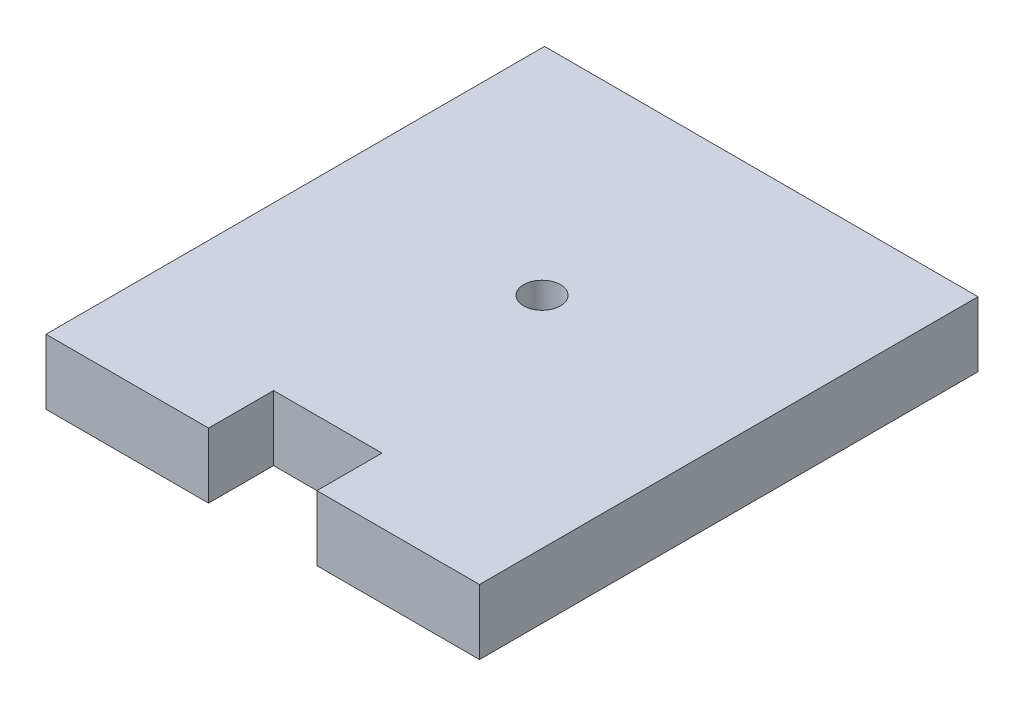
ISO-10303-21;
HEADER;
FILE_DESCRIPTION(('STEP AP214'),'2;1');
FILE_NAME('part.step','',(''),(''),'','','');
FILE_SCHEMA(('AUTOMOTIVE_DESIGN { 1 0 10303 214 1 1 1 1 }'));
ENDSEC;
DATA;
#1=APPLICATION_CONTEXT('core data for automotive mechanical design processes');
#2=APPLICATION_PROTOCOL_DEFINITION('international standard','automotive_design',2000,#1);
#3=PRODUCT_CONTEXT('',#1,'mechanical');
#4=PRODUCT('Part','Part','',(#3));
#5=PRODUCT_RELATED_PRODUCT_CATEGORY('part','',(#4));
#6=PRODUCT_DEFINITION_FORMATION('','',#4);
#7=PRODUCT_DEFINITION_CONTEXT('part definition',#1,'design');
#8=PRODUCT_DEFINITION('design','',#6,#7);
#9=PRODUCT_DEFINITION_SHAPE('','',#8);
#10=(LENGTH_UNIT() NAMED_UNIT(*) SI_UNIT(.MILLI.,.METRE.));
#11=(NAMED_UNIT(*) PLANE_ANGLE_UNIT() SI_UNIT($,.RADIAN.));
#12=(NAMED_UNIT(*) SI_UNIT($,.STERADIAN.) SOLID_ANGLE_UNIT());
#13=UNCERTAINTY_MEASURE_WITH_UNIT(LENGTH_MEASURE(1.E-05),#10,'distance_accuracy_value','');
#14=(GEOMETRIC_REPRESENTATION_CONTEXT(3) GLOBAL_UNCERTAINTY_ASSIGNED_CONTEXT((#13)) GLOBAL_UNIT_ASSIGNED_CONTEXT((#10,
#11,#12)) REPRESENTATION_CONTEXT('',''));
#15=CARTESIAN_POINT('',(0.,0.,0.));
#16=DIRECTION('',(0.,0.,1.));
#17=DIRECTION('',(1.,0.,0.));
#18=AXIS2_PLACEMENT_3D('',#15,#16,#17);
#19=CARTESIAN_POINT('',(0.,3.,23.));
#20=DIRECTION('',(0.,0.,-1.));
#21=DIRECTION('',(-1.,0.,0.));
#22=AXIS2_PLACEMENT_3D('',#19,#20,#21);
#23=PLANE('',#22);
#24=DIRECTION('',(1.,0.,0.));
#25=VECTOR('',#24,1.);
#26=CARTESIAN_POINT('',(0.,0.,23.));
#27=LINE('',#26,#25);
#28=CARTESIAN_POINT('',(0.,0.,23.));
#29=VERTEX_POINT('',#28);
#30=CARTESIAN_POINT('',(7.5,0.,23.));
#31=VERTEX_POINT('',#30);
#32=EDGE_CURVE('E134',#29,#31,#27,.T.);
#33=ORIENTED_EDGE('',*,*,#32,.T.);
#34=DIRECTION('',(0.,1.,0.));
#35=VECTOR('',#34,1.);
#36=CARTESIAN_POINT('',(7.5,0.,23.));
#37=LINE('',#36,#35);
#38=CARTESIAN_POINT('',(7.5,3.,23.));
#39=VERTEX_POINT('',#38);
#40=EDGE_CURVE('E118',#31,#39,#37,.T.);
#41=ORIENTED_EDGE('',*,*,#40,.T.);
#42=DIRECTION('',(1.,0.,0.));
#43=VECTOR('',#42,1.);
#44=CARTESIAN_POINT('',(0.,3.,23.));
#45=LINE('',#44,#43);
#46=CARTESIAN_POINT('',(0.,3.,23.));
#47=VERTEX_POINT('',#46);
#48=EDGE_CURVE('E96',#47,#39,#45,.T.);
#49=ORIENTED_EDGE('',*,*,#48,.F.);
#50=DIRECTION('',(0.,-1.,0.));
#51=VECTOR('',#50,1.);
#52=CARTESIAN_POINT('',(0.,3.,23.));
#53=LINE('',#52,#51);
#54=EDGE_CURVE('E11',#47,#29,#53,.T.);
#55=ORIENTED_EDGE('',*,*,#54,.T.);
#56=EDGE_LOOP('',(#33,#41,#49,#55));
#57=FACE_BOUND('',#56,.T.);
#58=ADVANCED_FACE('F43',(#57),#23,.F.);
#59=CARTESIAN_POINT('',(0.,3.,0.));
#60=DIRECTION('',(0.,1.,0.));
#61=DIRECTION('',(0.,0.,1.));
#62=AXIS2_PLACEMENT_3D('',#59,#60,#61);
#63=PLANE('',#62);
#64=DIRECTION('',(0.,0.,1.));
#65=VECTOR('',#64,1.);
#66=CARTESIAN_POINT('',(7.5,3.,20.));
#67=LINE('',#66,#65);
#68=CARTESIAN_POINT('',(7.5,3.,20.));
#69=VERTEX_POINT('',#68);
#70=EDGE_CURVE('E124',#69,#39,#67,.T.);
#71=ORIENTED_EDGE('',*,*,#70,.F.);
#72=DIRECTION('',(-1.,0.,0.));
#73=VECTOR('',#72,1.);
#74=CARTESIAN_POINT('',(7.5,3.,20.));
#75=LINE('',#74,#73);
#76=CARTESIAN_POINT('',(12.5,3.,20.));
#77=VERTEX_POINT('',#76);
#78=EDGE_CURVE('E137',#77,#69,#75,.T.);
#79=ORIENTED_EDGE('',*,*,#78,.F.);
#80=DIRECTION('',(0.,0.,-1.));
#81=VECTOR('',#80,1.);
#82=CARTESIAN_POINT('',(12.5,3.,20.));
#83=LINE('',#82,#81);
#84=CARTESIAN_POINT('',(12.5,3.,23.));
#85=VERTEX_POINT('',#84);
#86=EDGE_CURVE('E200',#85,#77,#83,.T.);
#87=ORIENTED_EDGE('',*,*,#86,.F.);
#88=CARTESIAN_POINT('',(20.,3.,23.));
#89=VERTEX_POINT('',#88);
#90=EDGE_CURVE('E189',#85,#89,#45,.T.);
#91=ORIENTED_EDGE('',*,*,#90,.T.);
#92=DIRECTION('',(0.,0.,-1.));
#93=VECTOR('',#92,1.);
#94=CARTESIAN_POINT('',(20.,3.,0.));
#95=LINE('',#94,#93);
#96=CARTESIAN_POINT('',(20.,3.,0.));
#97=VERTEX_POINT('',#96);
#98=EDGE_CURVE('E168',#89,#97,#95,.T.);
#99=ORIENTED_EDGE('',*,*,#98,.T.);
#100=DIRECTION('',(-1.,0.,0.));
#101=VECTOR('',#100,1.);
#102=CARTESIAN_POINT('',(0.,3.,0.));
#103=LINE('',#102,#101);
#104=CARTESIAN_POINT('',(0.,3.,0.));
#105=VERTEX_POINT('',#104);
#106=EDGE_CURVE('E68',#97,#105,#103,.T.);
#107=ORIENTED_EDGE('',*,*,#106,.T.);
#108=DIRECTION('',(0.,0.,1.));
#109=VECTOR('',#108,1.);
#110=CARTESIAN_POINT('',(0.,3.,0.));
#111=LINE('',#110,#109);
#112=EDGE_CURVE('E154',#105,#47,#111,.T.);
#113=ORIENTED_EDGE('',*,*,#112,.T.);
#114=ORIENTED_EDGE('',*,*,#48,.T.);
#115=EDGE_LOOP('',(#71,#79,#87,#91,#99,#107,#113,#114));
#116=FACE_BOUND('',#115,.T.);
#117=CARTESIAN_POINT('',(9.8867626715409,3.,9.99935884481818));
#118=DIRECTION('',(0.,1.,0.));
#119=DIRECTION('',(0.,0.,1.));
#120=AXIS2_PLACEMENT_3D('',#117,#118,#119);
#121=CIRCLE('',#120,0.85);
#122=CARTESIAN_POINT('',(9.8867626715409,3.,10.8493588448182));
#123=VERTEX_POINT('',#122);
#124=EDGE_CURVE('E174',#123,#123,#121,.T.);
#125=ORIENTED_EDGE('',*,*,#124,.F.);
#126=EDGE_LOOP('',(#125));
#127=FACE_BOUND('',#126,.T.);
#128=ADVANCED_FACE('F196',(#116,#127),#63,.T.);
#129=CARTESIAN_POINT('',(0.,0.,0.));
#130=DIRECTION('',(0.,1.,0.));
#131=DIRECTION('',(0.,0.,1.));
#132=AXIS2_PLACEMENT_3D('',#129,#130,#131);
#133=PLANE('',#132);
#134=DIRECTION('',(-1.,0.,0.));
#135=VECTOR('',#134,1.);
#136=CARTESIAN_POINT('',(7.5,0.,20.));
#137=LINE('',#136,#135);
#138=CARTESIAN_POINT('',(12.5,0.,20.));
#139=VERTEX_POINT('',#138);
#140=CARTESIAN_POINT('',(7.5,0.,20.));
#141=VERTEX_POINT('',#140);
#142=EDGE_CURVE('E128',#139,#141,#137,.T.);
#143=ORIENTED_EDGE('',*,*,#142,.T.);
#144=DIRECTION('',(0.,0.,1.));
#145=VECTOR('',#144,1.);
#146=CARTESIAN_POINT('',(7.5,0.,20.));
#147=LINE('',#146,#145);
#148=EDGE_CURVE('E121',#141,#31,#147,.T.);
#149=ORIENTED_EDGE('',*,*,#148,.T.);
#150=ORIENTED_EDGE('',*,*,#32,.F.);
#151=DIRECTION('',(0.,0.,1.));
#152=VECTOR('',#151,1.);
#153=CARTESIAN_POINT('',(0.,0.,0.));
#154=LINE('',#153,#152);
#155=CARTESIAN_POINT('',(0.,0.,0.));
#156=VERTEX_POINT('',#155);
#157=EDGE_CURVE('E148',#156,#29,#154,.T.);
#158=ORIENTED_EDGE('',*,*,#157,.F.);
#159=DIRECTION('',(-1.,0.,0.));
#160=VECTOR('',#159,1.);
#161=CARTESIAN_POINT('',(0.,0.,0.));
#162=LINE('',#161,#160);
#163=CARTESIAN_POINT('',(20.,0.,0.));
#164=VERTEX_POINT('',#163);
#165=EDGE_CURVE('E89',#164,#156,#162,.T.);
#166=ORIENTED_EDGE('',*,*,#165,.F.);
#167=DIRECTION('',(0.,0.,-1.));
#168=VECTOR('',#167,1.);
#169=CARTESIAN_POINT('',(20.,0.,0.));
#170=LINE('',#169,#168);
#171=CARTESIAN_POINT('',(20.,0.,23.));
#172=VERTEX_POINT('',#171);
#173=EDGE_CURVE('E142',#172,#164,#170,.T.);
#174=ORIENTED_EDGE('',*,*,#173,.F.);
#175=CARTESIAN_POINT('',(12.5,0.,23.));
#176=VERTEX_POINT('',#175);
#177=EDGE_CURVE('E143',#176,#172,#27,.T.);
#178=ORIENTED_EDGE('',*,*,#177,.F.);
#179=DIRECTION('',(0.,0.,-1.));
#180=VECTOR('',#179,1.);
#181=CARTESIAN_POINT('',(12.5,0.,20.));
#182=LINE('',#181,#180);
#183=EDGE_CURVE('E59',#176,#139,#182,.T.);
#184=ORIENTED_EDGE('',*,*,#183,.T.);
#185=EDGE_LOOP('',(#143,#149,#150,#158,#166,#174,#178,#184));
#186=FACE_BOUND('',#185,.T.);
#187=CARTESIAN_POINT('',(9.8867626715409,0.,9.99935884481818));
#188=DIRECTION('',(0.,1.,0.));
#189=DIRECTION('',(0.,0.,1.));
#190=AXIS2_PLACEMENT_3D('',#187,#188,#189);
#191=CIRCLE('',#190,0.85);
#192=CARTESIAN_POINT('',(9.8867626715409,0.,10.8493588448182));
#193=VERTEX_POINT('',#192);
#194=EDGE_CURVE('E177',#193,#193,#191,.T.);
#195=ORIENTED_EDGE('',*,*,#194,.T.);
#196=EDGE_LOOP('',(#195));
#197=FACE_BOUND('',#196,.T.);
#198=ADVANCED_FACE('F131',(#186,#197),#133,.F.);
#199=CARTESIAN_POINT('',(0.,3.,0.));
#200=DIRECTION('',(1.,0.,0.));
#201=DIRECTION('',(0.,0.,-1.));
#202=AXIS2_PLACEMENT_3D('',#199,#200,#201);
#203=PLANE('',#202);
#204=ORIENTED_EDGE('',*,*,#157,.T.);
#205=ORIENTED_EDGE('',*,*,#54,.F.);
#206=ORIENTED_EDGE('',*,*,#112,.F.);
#207=DIRECTION('',(0.,-1.,0.));
#208=VECTOR('',#207,1.);
#209=CARTESIAN_POINT('',(0.,3.,0.));
#210=LINE('',#209,#208);
#211=EDGE_CURVE('E155',#105,#156,#210,.T.);
#212=ORIENTED_EDGE('',*,*,#211,.T.);
#213=EDGE_LOOP('',(#204,#205,#206,#212));
#214=FACE_BOUND('',#213,.T.);
#215=ADVANCED_FACE('F45',(#214),#203,.F.);
#216=ORIENTED_EDGE('',*,*,#90,.F.);
#217=DIRECTION('',(0.,1.,0.));
#218=VECTOR('',#217,1.);
#219=CARTESIAN_POINT('',(12.5,0.,23.));
#220=LINE('',#219,#218);
#221=EDGE_CURVE('E127',#176,#85,#220,.T.);
#222=ORIENTED_EDGE('',*,*,#221,.F.);
#223=ORIENTED_EDGE('',*,*,#177,.T.);
#224=DIRECTION('',(0.,-1.,0.));
#225=VECTOR('',#224,1.);
#226=CARTESIAN_POINT('',(20.,3.,23.));
#227=LINE('',#226,#225);
#228=EDGE_CURVE('E52',#89,#172,#227,.T.);
#229=ORIENTED_EDGE('',*,*,#228,.F.);
#230=EDGE_LOOP('',(#216,#222,#223,#229));
#231=FACE_BOUND('',#230,.T.);
#232=ADVANCED_FACE('F201',(#231),#23,.F.);
#233=CARTESIAN_POINT('',(20.,3.,0.));
#234=DIRECTION('',(-1.,0.,0.));
#235=DIRECTION('',(0.,0.,1.));
#236=AXIS2_PLACEMENT_3D('',#233,#234,#235);
#237=PLANE('',#236);
#238=ORIENTED_EDGE('',*,*,#173,.T.);
#239=DIRECTION('',(0.,-1.,0.));
#240=VECTOR('',#239,1.);
#241=CARTESIAN_POINT('',(20.,3.,0.));
#242=LINE('',#241,#240);
#243=EDGE_CURVE('E158',#97,#164,#242,.T.);
#244=ORIENTED_EDGE('',*,*,#243,.F.);
#245=ORIENTED_EDGE('',*,*,#98,.F.);
#246=ORIENTED_EDGE('',*,*,#228,.T.);
#247=EDGE_LOOP('',(#238,#244,#245,#246));
#248=FACE_BOUND('',#247,.T.);
#249=ADVANCED_FACE('F166',(#248),#237,.F.);
#250=CARTESIAN_POINT('',(0.,3.,0.));
#251=DIRECTION('',(0.,0.,1.));
#252=DIRECTION('',(1.,0.,0.));
#253=AXIS2_PLACEMENT_3D('',#250,#251,#252);
#254=PLANE('',#253);
#255=ORIENTED_EDGE('',*,*,#165,.T.);
#256=ORIENTED_EDGE('',*,*,#211,.F.);
#257=ORIENTED_EDGE('',*,*,#106,.F.);
#258=ORIENTED_EDGE('',*,*,#243,.T.);
#259=EDGE_LOOP('',(#255,#256,#257,#258));
#260=FACE_BOUND('',#259,.T.);
#261=ADVANCED_FACE('F242',(#260),#254,.F.);
#262=CARTESIAN_POINT('',(9.8867626715409,3.,9.99935884481818));
#263=DIRECTION('',(0.,-1.,0.));
#264=DIRECTION('',(0.,0.,-1.));
#265=AXIS2_PLACEMENT_3D('',#262,#263,#264);
#266=CYLINDRICAL_SURFACE('',#265,0.85);
#267=ORIENTED_EDGE('',*,*,#124,.T.);
#268=EDGE_LOOP('',(#267));
#269=FACE_BOUND('',#268,.T.);
#270=ORIENTED_EDGE('',*,*,#194,.F.);
#271=EDGE_LOOP('',(#270));
#272=FACE_BOUND('',#271,.T.);
#273=ADVANCED_FACE('F229',(#269,#272),#266,.F.);
#274=CARTESIAN_POINT('',(7.5,0.,20.));
#275=DIRECTION('',(-1.,0.,0.));
#276=DIRECTION('',(0.,0.,1.));
#277=AXIS2_PLACEMENT_3D('',#274,#275,#276);
#278=PLANE('',#277);
#279=ORIENTED_EDGE('',*,*,#70,.T.);
#280=ORIENTED_EDGE('',*,*,#40,.F.);
#281=ORIENTED_EDGE('',*,*,#148,.F.);
#282=DIRECTION('',(0.,1.,0.));
#283=VECTOR('',#282,1.);
#284=CARTESIAN_POINT('',(7.5,0.,20.));
#285=LINE('',#284,#283);
#286=EDGE_CURVE('E183',#141,#69,#285,.T.);
#287=ORIENTED_EDGE('',*,*,#286,.T.);
#288=EDGE_LOOP('',(#279,#280,#281,#287));
#289=FACE_BOUND('',#288,.T.);
#290=ADVANCED_FACE('F120',(#289),#278,.F.);
#291=CARTESIAN_POINT('',(7.5,0.,20.));
#292=DIRECTION('',(0.,0.,-1.));
#293=DIRECTION('',(-1.,0.,0.));
#294=AXIS2_PLACEMENT_3D('',#291,#292,#293);
#295=PLANE('',#294);
#296=ORIENTED_EDGE('',*,*,#78,.T.);
#297=ORIENTED_EDGE('',*,*,#286,.F.);
#298=ORIENTED_EDGE('',*,*,#142,.F.);
#299=DIRECTION('',(0.,1.,0.));
#300=VECTOR('',#299,1.);
#301=CARTESIAN_POINT('',(12.5,0.,20.));
#302=LINE('',#301,#300);
#303=EDGE_CURVE('E203',#139,#77,#302,.T.);
#304=ORIENTED_EDGE('',*,*,#303,.T.);
#305=EDGE_LOOP('',(#296,#297,#298,#304));
#306=FACE_BOUND('',#305,.T.);
#307=ADVANCED_FACE('F221',(#306),#295,.F.);
#308=CARTESIAN_POINT('',(12.5,0.,20.));
#309=DIRECTION('',(1.,0.,0.));
#310=DIRECTION('',(0.,0.,-1.));
#311=AXIS2_PLACEMENT_3D('',#308,#309,#310);
#312=PLANE('',#311);
#313=ORIENTED_EDGE('',*,*,#86,.T.);
#314=ORIENTED_EDGE('',*,*,#303,.F.);
#315=ORIENTED_EDGE('',*,*,#183,.F.);
#316=ORIENTED_EDGE('',*,*,#221,.T.);
#317=EDGE_LOOP('',(#313,#314,#315,#316));
#318=FACE_BOUND('',#317,.T.);
#319=ADVANCED_FACE('F219',(#318),#312,.F.);
#320=CLOSED_SHELL('',(#58,#128,#198,#215,#232,#249,#261,#273,#290,#307,#319));
#321=MANIFOLD_SOLID_BREP('B2',#320);
#322=ADVANCED_BREP_SHAPE_REPRESENTATION('',(#18,#321),#14);
#323=SHAPE_DEFINITION_REPRESENTATION(#9,#322);
ENDSEC;
END-ISO-10303-21;
